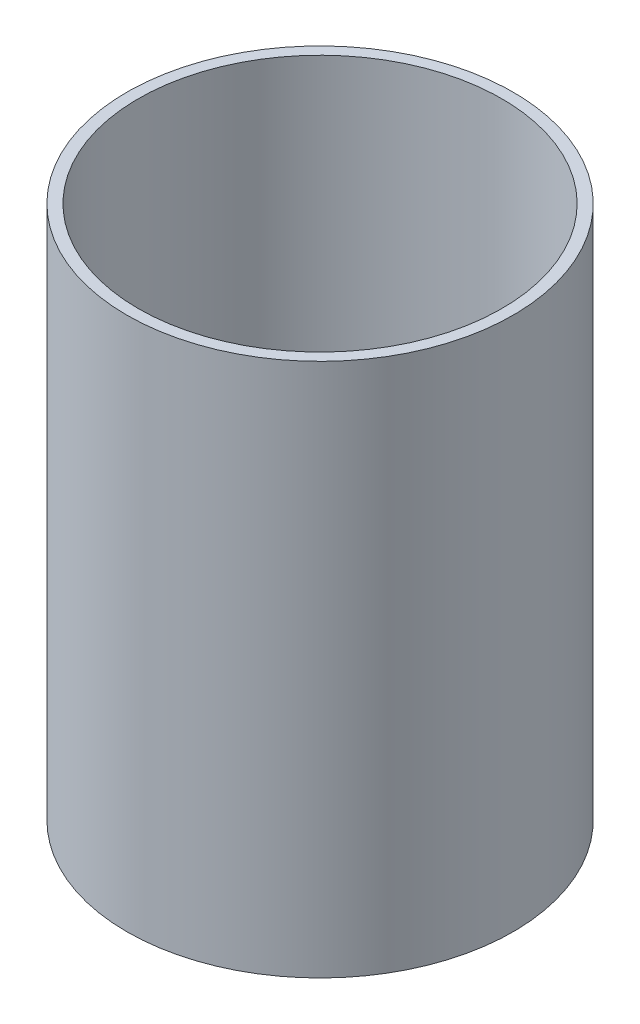
ISO-10303-21;
HEADER;
FILE_DESCRIPTION(('STEP AP214'),'2;1');
FILE_NAME('part.step','',(''),(''),'','','');
FILE_SCHEMA(('AUTOMOTIVE_DESIGN { 1 0 10303 214 1 1 1 1 }'));
ENDSEC;
DATA;
#1=APPLICATION_CONTEXT('core data for automotive mechanical design processes');
#2=APPLICATION_PROTOCOL_DEFINITION('international standard','automotive_design',2000,#1);
#3=PRODUCT_CONTEXT('',#1,'mechanical');
#4=PRODUCT('Part','Part','',(#3));
#5=PRODUCT_RELATED_PRODUCT_CATEGORY('part','',(#4));
#6=PRODUCT_DEFINITION_FORMATION('','',#4);
#7=PRODUCT_DEFINITION_CONTEXT('part definition',#1,'design');
#8=PRODUCT_DEFINITION('design','',#6,#7);
#9=PRODUCT_DEFINITION_SHAPE('','',#8);
#10=(LENGTH_UNIT() NAMED_UNIT(*) SI_UNIT(.MILLI.,.METRE.));
#11=(NAMED_UNIT(*) PLANE_ANGLE_UNIT() SI_UNIT($,.RADIAN.));
#12=(NAMED_UNIT(*) SI_UNIT($,.STERADIAN.) SOLID_ANGLE_UNIT());
#13=UNCERTAINTY_MEASURE_WITH_UNIT(LENGTH_MEASURE(1.E-05),#10,'distance_accuracy_value','');
#14=(GEOMETRIC_REPRESENTATION_CONTEXT(3) GLOBAL_UNCERTAINTY_ASSIGNED_CONTEXT((#13)) GLOBAL_UNIT_ASSIGNED_CONTEXT((#10,
#11,#12)) REPRESENTATION_CONTEXT('',''));
#15=CARTESIAN_POINT('',(0.,0.,0.));
#16=DIRECTION('',(0.,0.,1.));
#17=DIRECTION('',(1.,0.,0.));
#18=AXIS2_PLACEMENT_3D('',#15,#16,#17);
#19=CARTESIAN_POINT('',(0.,298.45,0.));
#20=DIRECTION('',(0.,1.,0.));
#21=DIRECTION('',(0.,0.,1.));
#22=AXIS2_PLACEMENT_3D('',#19,#20,#21);
#23=PLANE('',#22);
#24=CARTESIAN_POINT('',(0.,298.45,0.));
#25=DIRECTION('',(0.,1.,0.));
#26=DIRECTION('',(0.,0.,1.));
#27=AXIS2_PLACEMENT_3D('',#24,#25,#26);
#28=CIRCLE('',#27,107.95);
#29=CARTESIAN_POINT('',(0.,298.45,107.95));
#30=VERTEX_POINT('',#29);
#31=EDGE_CURVE('E10',#30,#30,#28,.T.);
#32=ORIENTED_EDGE('',*,*,#31,.T.);
#33=EDGE_LOOP('',(#32));
#34=FACE_BOUND('',#33,.T.);
#35=CARTESIAN_POINT('',(0.,298.45,0.));
#36=DIRECTION('',(0.,1.,0.));
#37=DIRECTION('',(0.,0.,1.));
#38=AXIS2_PLACEMENT_3D('',#35,#36,#37);
#39=CIRCLE('',#38,101.6);
#40=CARTESIAN_POINT('',(0.,298.45,101.6));
#41=VERTEX_POINT('',#40);
#42=EDGE_CURVE('E50',#41,#41,#39,.T.);
#43=ORIENTED_EDGE('',*,*,#42,.F.);
#44=EDGE_LOOP('',(#43));
#45=FACE_BOUND('',#44,.T.);
#46=ADVANCED_FACE('F36',(#34,#45),#23,.T.);
#47=CARTESIAN_POINT('',(0.,0.,0.));
#48=DIRECTION('',(0.,1.,0.));
#49=DIRECTION('',(0.,0.,1.));
#50=AXIS2_PLACEMENT_3D('',#47,#48,#49);
#51=PLANE('',#50);
#52=CARTESIAN_POINT('',(0.,0.,0.));
#53=DIRECTION('',(0.,1.,0.));
#54=DIRECTION('',(0.,0.,1.));
#55=AXIS2_PLACEMENT_3D('',#52,#53,#54);
#56=CIRCLE('',#55,107.95);
#57=CARTESIAN_POINT('',(0.,0.,107.95));
#58=VERTEX_POINT('',#57);
#59=EDGE_CURVE('E40',#58,#58,#56,.T.);
#60=ORIENTED_EDGE('',*,*,#59,.F.);
#61=EDGE_LOOP('',(#60));
#62=FACE_BOUND('',#61,.T.);
#63=CARTESIAN_POINT('',(0.,0.,0.));
#64=DIRECTION('',(0.,1.,0.));
#65=DIRECTION('',(0.,0.,1.));
#66=AXIS2_PLACEMENT_3D('',#63,#64,#65);
#67=CIRCLE('',#66,101.6);
#68=CARTESIAN_POINT('',(0.,0.,101.6));
#69=VERTEX_POINT('',#68);
#70=EDGE_CURVE('E52',#69,#69,#67,.T.);
#71=ORIENTED_EDGE('',*,*,#70,.T.);
#72=EDGE_LOOP('',(#71));
#73=FACE_BOUND('',#72,.T.);
#74=ADVANCED_FACE('F63',(#62,#73),#51,.F.);
#75=CARTESIAN_POINT('',(0.,298.45,0.));
#76=DIRECTION('',(0.,-1.,0.));
#77=DIRECTION('',(0.,0.,-1.));
#78=AXIS2_PLACEMENT_3D('',#75,#76,#77);
#79=CYLINDRICAL_SURFACE('',#78,107.95);
#80=ORIENTED_EDGE('',*,*,#31,.F.);
#81=EDGE_LOOP('',(#80));
#82=FACE_BOUND('',#81,.T.);
#83=ORIENTED_EDGE('',*,*,#59,.T.);
#84=EDGE_LOOP('',(#83));
#85=FACE_BOUND('',#84,.T.);
#86=ADVANCED_FACE('F38',(#82,#85),#79,.T.);
#87=CARTESIAN_POINT('',(0.,298.45,0.));
#88=DIRECTION('',(0.,-1.,0.));
#89=DIRECTION('',(0.,0.,-1.));
#90=AXIS2_PLACEMENT_3D('',#87,#88,#89);
#91=CYLINDRICAL_SURFACE('',#90,101.6);
#92=ORIENTED_EDGE('',*,*,#42,.T.);
#93=EDGE_LOOP('',(#92));
#94=FACE_BOUND('',#93,.T.);
#95=ORIENTED_EDGE('',*,*,#70,.F.);
#96=EDGE_LOOP('',(#95));
#97=FACE_BOUND('',#96,.T.);
#98=ADVANCED_FACE('F59',(#94,#97),#91,.F.);
#99=CLOSED_SHELL('',(#46,#74,#86,#98));
#100=MANIFOLD_SOLID_BREP('B2',#99);
#101=ADVANCED_BREP_SHAPE_REPRESENTATION('',(#18,#100),#14);
#102=SHAPE_DEFINITION_REPRESENTATION(#9,#101);
ENDSEC;
END-ISO-10303-21;
